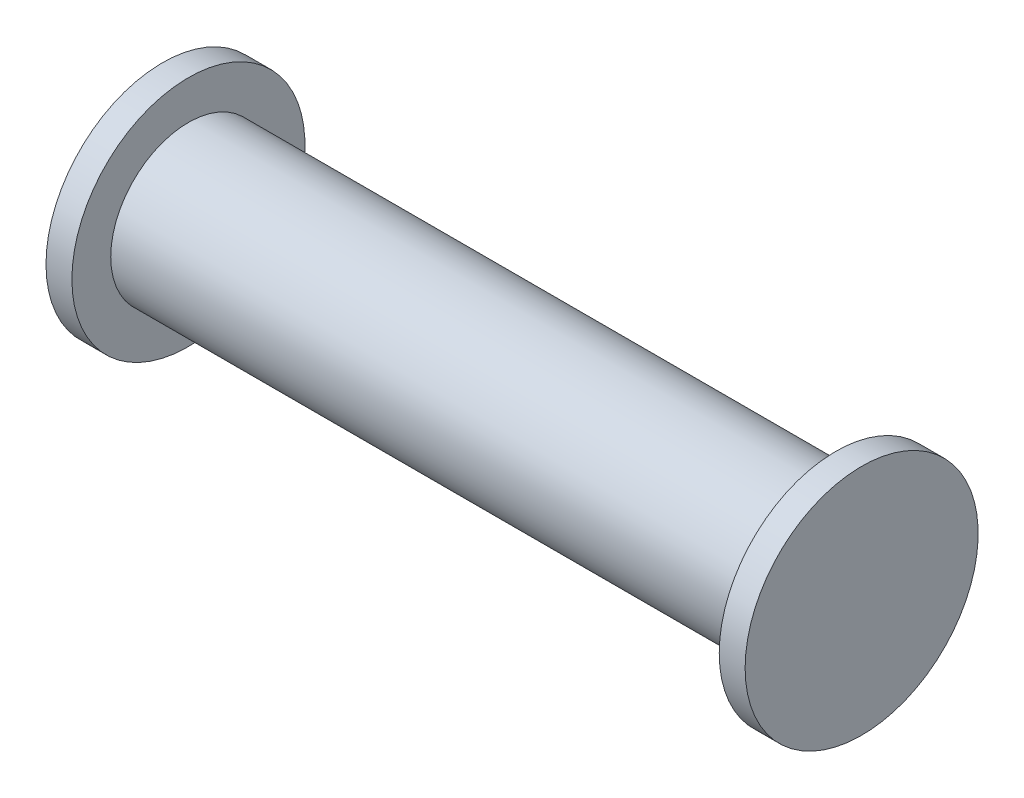
ISO-10303-21;
HEADER;
FILE_DESCRIPTION(('STEP AP214'),'2;1');
FILE_NAME('part.step','',(''),(''),'','','');
FILE_SCHEMA(('AUTOMOTIVE_DESIGN { 1 0 10303 214 1 1 1 1 }'));
ENDSEC;
DATA;
#1=APPLICATION_CONTEXT('core data for automotive mechanical design processes');
#2=APPLICATION_PROTOCOL_DEFINITION('international standard','automotive_design',2000,#1);
#3=PRODUCT_CONTEXT('',#1,'mechanical');
#4=PRODUCT('Part','Part','',(#3));
#5=PRODUCT_RELATED_PRODUCT_CATEGORY('part','',(#4));
#6=PRODUCT_DEFINITION_FORMATION('','',#4);
#7=PRODUCT_DEFINITION_CONTEXT('part definition',#1,'design');
#8=PRODUCT_DEFINITION('design','',#6,#7);
#9=PRODUCT_DEFINITION_SHAPE('','',#8);
#10=(LENGTH_UNIT() NAMED_UNIT(*) SI_UNIT(.MILLI.,.METRE.));
#11=(NAMED_UNIT(*) PLANE_ANGLE_UNIT() SI_UNIT($,.RADIAN.));
#12=(NAMED_UNIT(*) SI_UNIT($,.STERADIAN.) SOLID_ANGLE_UNIT());
#13=UNCERTAINTY_MEASURE_WITH_UNIT(LENGTH_MEASURE(1.E-05),#10,'distance_accuracy_value','');
#14=(GEOMETRIC_REPRESENTATION_CONTEXT(3) GLOBAL_UNCERTAINTY_ASSIGNED_CONTEXT((#13)) GLOBAL_UNIT_ASSIGNED_CONTEXT((#10,
#11,#12)) REPRESENTATION_CONTEXT('',''));
#15=CARTESIAN_POINT('',(0.,0.,0.));
#16=DIRECTION('',(0.,0.,1.));
#17=DIRECTION('',(1.,0.,0.));
#18=AXIS2_PLACEMENT_3D('',#15,#16,#17);
#19=CARTESIAN_POINT('',(0.,0.,0.));
#20=DIRECTION('',(-1.,0.,0.));
#21=DIRECTION('',(0.,0.,1.));
#22=AXIS2_PLACEMENT_3D('',#19,#20,#21);
#23=PLANE('',#22);
#24=CARTESIAN_POINT('',(0.,0.,0.));
#25=DIRECTION('',(-1.,0.,0.));
#26=DIRECTION('',(0.,0.,1.));
#27=AXIS2_PLACEMENT_3D('',#24,#25,#26);
#28=CIRCLE('',#27,7.14375);
#29=CARTESIAN_POINT('',(0.,0.,7.14375));
#30=VERTEX_POINT('',#29);
#31=EDGE_CURVE('E64',#30,#30,#28,.T.);
#32=ORIENTED_EDGE('',*,*,#31,.T.);
#33=EDGE_LOOP('',(#32));
#34=FACE_BOUND('',#33,.T.);
#35=ADVANCED_FACE('F39',(#34),#23,.T.);
#36=CARTESIAN_POINT('',(0.,0.,0.));
#37=DIRECTION('',(-1.,0.,0.));
#38=DIRECTION('',(0.,0.,1.));
#39=AXIS2_PLACEMENT_3D('',#36,#37,#38);
#40=CYLINDRICAL_SURFACE('',#39,7.14375);
#41=CARTESIAN_POINT('',(1.5875,0.,0.));
#42=DIRECTION('',(-1.,0.,0.));
#43=DIRECTION('',(0.,0.,1.));
#44=AXIS2_PLACEMENT_3D('',#41,#42,#43);
#45=CIRCLE('',#44,7.14375);
#46=CARTESIAN_POINT('',(1.5875,0.,7.14375));
#47=VERTEX_POINT('',#46);
#48=EDGE_CURVE('E54',#47,#47,#45,.T.);
#49=ORIENTED_EDGE('',*,*,#48,.T.);
#50=EDGE_LOOP('',(#49));
#51=FACE_BOUND('',#50,.T.);
#52=ORIENTED_EDGE('',*,*,#31,.F.);
#53=EDGE_LOOP('',(#52));
#54=FACE_BOUND('',#53,.T.);
#55=ADVANCED_FACE('F76',(#51,#54),#40,.T.);
#56=CARTESIAN_POINT('',(1.5875,0.,0.));
#57=DIRECTION('',(-1.,0.,0.));
#58=DIRECTION('',(0.,0.,1.));
#59=AXIS2_PLACEMENT_3D('',#56,#57,#58);
#60=PLANE('',#59);
#61=ORIENTED_EDGE('',*,*,#48,.F.);
#62=EDGE_LOOP('',(#61));
#63=FACE_BOUND('',#62,.T.);
#64=CARTESIAN_POINT('',(1.5875,0.,0.));
#65=DIRECTION('',(-1.,0.,0.));
#66=DIRECTION('',(0.,0.,1.));
#67=AXIS2_PLACEMENT_3D('',#64,#65,#66);
#68=CIRCLE('',#67,4.7625);
#69=CARTESIAN_POINT('',(1.5875,0.,4.7625));
#70=VERTEX_POINT('',#69);
#71=EDGE_CURVE('E48',#70,#70,#68,.T.);
#72=ORIENTED_EDGE('',*,*,#71,.T.);
#73=EDGE_LOOP('',(#72));
#74=FACE_BOUND('',#73,.T.);
#75=ADVANCED_FACE('F79',(#63,#74),#60,.F.);
#76=CARTESIAN_POINT('',(0.,0.,0.));
#77=DIRECTION('',(-1.,0.,0.));
#78=DIRECTION('',(0.,0.,1.));
#79=AXIS2_PLACEMENT_3D('',#76,#77,#78);
#80=CYLINDRICAL_SURFACE('',#79,4.7625);
#81=CARTESIAN_POINT('',(41.275,0.,0.));
#82=DIRECTION('',(-1.,0.,0.));
#83=DIRECTION('',(0.,0.,1.));
#84=AXIS2_PLACEMENT_3D('',#81,#82,#83);
#85=CIRCLE('',#84,4.7625);
#86=CARTESIAN_POINT('',(41.275,0.,4.7625));
#87=VERTEX_POINT('',#86);
#88=EDGE_CURVE('E10',#87,#87,#85,.F.);
#89=ORIENTED_EDGE('',*,*,#88,.F.);
#90=EDGE_LOOP('',(#89));
#91=FACE_BOUND('',#90,.T.);
#92=ORIENTED_EDGE('',*,*,#71,.F.);
#93=EDGE_LOOP('',(#92));
#94=FACE_BOUND('',#93,.T.);
#95=ADVANCED_FACE('F82',(#91,#94),#80,.T.);
#96=CARTESIAN_POINT('',(42.8625,0.,0.));
#97=DIRECTION('',(-1.,0.,0.));
#98=DIRECTION('',(0.,0.,1.));
#99=AXIS2_PLACEMENT_3D('',#96,#97,#98);
#100=PLANE('',#99);
#101=CARTESIAN_POINT('',(42.8625,0.,0.));
#102=DIRECTION('',(-1.,0.,0.));
#103=DIRECTION('',(0.,0.,1.));
#104=AXIS2_PLACEMENT_3D('',#101,#102,#103);
#105=CIRCLE('',#104,7.14375);
#106=CARTESIAN_POINT('',(42.8625,0.,7.14375));
#107=VERTEX_POINT('',#106);
#108=EDGE_CURVE('E43',#107,#107,#105,.T.);
#109=ORIENTED_EDGE('',*,*,#108,.F.);
#110=EDGE_LOOP('',(#109));
#111=FACE_BOUND('',#110,.T.);
#112=ADVANCED_FACE('F87',(#111),#100,.F.);
#113=CARTESIAN_POINT('',(0.,0.,0.));
#114=DIRECTION('',(-1.,0.,0.));
#115=DIRECTION('',(0.,0.,1.));
#116=AXIS2_PLACEMENT_3D('',#113,#114,#115);
#117=CYLINDRICAL_SURFACE('',#116,7.14375);
#118=CARTESIAN_POINT('',(41.275,0.,0.));
#119=DIRECTION('',(-1.,0.,0.));
#120=DIRECTION('',(0.,0.,1.));
#121=AXIS2_PLACEMENT_3D('',#118,#119,#120);
#122=CIRCLE('',#121,7.14375);
#123=CARTESIAN_POINT('',(41.275,0.,7.14375));
#124=VERTEX_POINT('',#123);
#125=EDGE_CURVE('E57',#124,#124,#122,.T.);
#126=ORIENTED_EDGE('',*,*,#125,.F.);
#127=EDGE_LOOP('',(#126));
#128=FACE_BOUND('',#127,.T.);
#129=ORIENTED_EDGE('',*,*,#108,.T.);
#130=EDGE_LOOP('',(#129));
#131=FACE_BOUND('',#130,.T.);
#132=ADVANCED_FACE('F41',(#128,#131),#117,.T.);
#133=CARTESIAN_POINT('',(41.275,4.7625,0.));
#134=DIRECTION('',(-1.,0.,0.));
#135=DIRECTION('',(0.,0.,1.));
#136=AXIS2_PLACEMENT_3D('',#133,#134,#135);
#137=PLANE('',#136);
#138=ORIENTED_EDGE('',*,*,#125,.T.);
#139=EDGE_LOOP('',(#138));
#140=FACE_BOUND('',#139,.T.);
#141=ORIENTED_EDGE('',*,*,#88,.T.);
#142=EDGE_LOOP('',(#141));
#143=FACE_BOUND('',#142,.T.);
#144=ADVANCED_FACE('F96',(#140,#143),#137,.T.);
#145=CLOSED_SHELL('',(#35,#55,#75,#95,#112,#132,#144));
#146=MANIFOLD_SOLID_BREP('B2',#145);
#147=ADVANCED_BREP_SHAPE_REPRESENTATION('',(#18,#146),#14);
#148=SHAPE_DEFINITION_REPRESENTATION(#9,#147);
ENDSEC;
END-ISO-10303-21;
